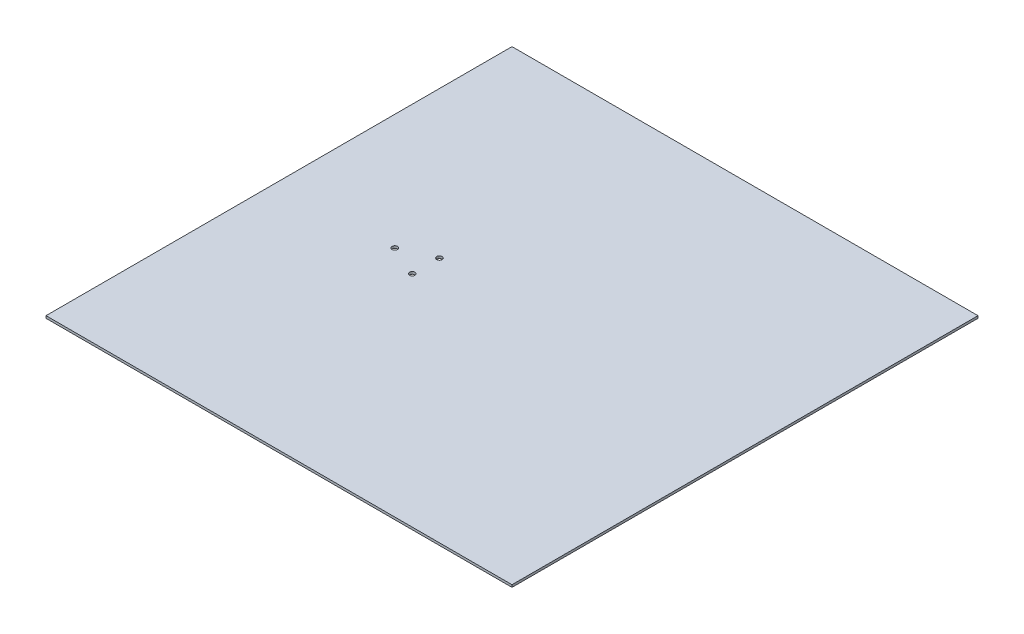
ISO-10303-21;
HEADER;
FILE_DESCRIPTION(('STEP AP214'),'2;1');
FILE_NAME('part.step','',(''),(''),'','','');
FILE_SCHEMA(('AUTOMOTIVE_DESIGN { 1 0 10303 214 1 1 1 1 }'));
ENDSEC;
DATA;
#1=APPLICATION_CONTEXT('core data for automotive mechanical design processes');
#2=APPLICATION_PROTOCOL_DEFINITION('international standard','automotive_design',2000,#1);
#3=PRODUCT_CONTEXT('',#1,'mechanical');
#4=PRODUCT('Part','Part','',(#3));
#5=PRODUCT_RELATED_PRODUCT_CATEGORY('part','',(#4));
#6=PRODUCT_DEFINITION_FORMATION('','',#4);
#7=PRODUCT_DEFINITION_CONTEXT('part definition',#1,'design');
#8=PRODUCT_DEFINITION('design','',#6,#7);
#9=PRODUCT_DEFINITION_SHAPE('','',#8);
#10=(LENGTH_UNIT() NAMED_UNIT(*) SI_UNIT(.MILLI.,.METRE.));
#11=(NAMED_UNIT(*) PLANE_ANGLE_UNIT() SI_UNIT($,.RADIAN.));
#12=(NAMED_UNIT(*) SI_UNIT($,.STERADIAN.) SOLID_ANGLE_UNIT());
#13=UNCERTAINTY_MEASURE_WITH_UNIT(LENGTH_MEASURE(1.E-05),#10,'distance_accuracy_value','');
#14=(GEOMETRIC_REPRESENTATION_CONTEXT(3) GLOBAL_UNCERTAINTY_ASSIGNED_CONTEXT((#13)) GLOBAL_UNIT_ASSIGNED_CONTEXT((#10,
#11,#12)) REPRESENTATION_CONTEXT('',''));
#15=CARTESIAN_POINT('',(0.,0.,0.));
#16=DIRECTION('',(0.,0.,1.));
#17=DIRECTION('',(1.,0.,0.));
#18=AXIS2_PLACEMENT_3D('',#15,#16,#17);
#19=CARTESIAN_POINT('',(300.,3.,-300.));
#20=DIRECTION('',(-1.,0.,0.));
#21=DIRECTION('',(0.,0.,1.));
#22=AXIS2_PLACEMENT_3D('',#19,#20,#21);
#23=PLANE('',#22);
#24=DIRECTION('',(0.,0.,-1.));
#25=VECTOR('',#24,1.);
#26=CARTESIAN_POINT('',(300.,0.,-300.));
#27=LINE('',#26,#25);
#28=CARTESIAN_POINT('',(300.,0.,300.));
#29=VERTEX_POINT('',#28);
#30=CARTESIAN_POINT('',(300.,0.,-300.));
#31=VERTEX_POINT('',#30);
#32=EDGE_CURVE('E99',#29,#31,#27,.T.);
#33=ORIENTED_EDGE('',*,*,#32,.T.);
#34=DIRECTION('',(0.,-1.,0.));
#35=VECTOR('',#34,1.);
#36=CARTESIAN_POINT('',(300.,3.,-300.));
#37=LINE('',#36,#35);
#38=CARTESIAN_POINT('',(300.,3.,-300.));
#39=VERTEX_POINT('',#38);
#40=EDGE_CURVE('E11',#39,#31,#37,.T.);
#41=ORIENTED_EDGE('',*,*,#40,.F.);
#42=DIRECTION('',(0.,0.,-1.));
#43=VECTOR('',#42,1.);
#44=CARTESIAN_POINT('',(300.,3.,-300.));
#45=LINE('',#44,#43);
#46=CARTESIAN_POINT('',(300.,3.,300.));
#47=VERTEX_POINT('',#46);
#48=EDGE_CURVE('E87',#47,#39,#45,.T.);
#49=ORIENTED_EDGE('',*,*,#48,.F.);
#50=DIRECTION('',(0.,-1.,0.));
#51=VECTOR('',#50,1.);
#52=CARTESIAN_POINT('',(300.,3.,300.));
#53=LINE('',#52,#51);
#54=EDGE_CURVE('E95',#47,#29,#53,.T.);
#55=ORIENTED_EDGE('',*,*,#54,.T.);
#56=EDGE_LOOP('',(#33,#41,#49,#55));
#57=FACE_BOUND('',#56,.T.);
#58=ADVANCED_FACE('F36',(#57),#23,.F.);
#59=CARTESIAN_POINT('',(-300.,3.,-300.));
#60=DIRECTION('',(0.,0.,1.));
#61=DIRECTION('',(1.,0.,0.));
#62=AXIS2_PLACEMENT_3D('',#59,#60,#61);
#63=PLANE('',#62);
#64=DIRECTION('',(-1.,0.,0.));
#65=VECTOR('',#64,1.);
#66=CARTESIAN_POINT('',(-300.,0.,-300.));
#67=LINE('',#66,#65);
#68=CARTESIAN_POINT('',(-300.,0.,-300.));
#69=VERTEX_POINT('',#68);
#70=EDGE_CURVE('E91',#31,#69,#67,.T.);
#71=ORIENTED_EDGE('',*,*,#70,.T.);
#72=DIRECTION('',(0.,-1.,0.));
#73=VECTOR('',#72,1.);
#74=CARTESIAN_POINT('',(-300.,3.,-300.));
#75=LINE('',#74,#73);
#76=CARTESIAN_POINT('',(-300.,3.,-300.));
#77=VERTEX_POINT('',#76);
#78=EDGE_CURVE('E44',#77,#69,#75,.T.);
#79=ORIENTED_EDGE('',*,*,#78,.F.);
#80=DIRECTION('',(-1.,0.,0.));
#81=VECTOR('',#80,1.);
#82=CARTESIAN_POINT('',(-300.,3.,-300.));
#83=LINE('',#82,#81);
#84=EDGE_CURVE('E82',#39,#77,#83,.T.);
#85=ORIENTED_EDGE('',*,*,#84,.F.);
#86=ORIENTED_EDGE('',*,*,#40,.T.);
#87=EDGE_LOOP('',(#71,#79,#85,#86));
#88=FACE_BOUND('',#87,.T.);
#89=ADVANCED_FACE('F90',(#88),#63,.F.);
#90=CARTESIAN_POINT('',(-300.,3.,-300.));
#91=DIRECTION('',(1.,0.,0.));
#92=DIRECTION('',(0.,0.,-1.));
#93=AXIS2_PLACEMENT_3D('',#90,#91,#92);
#94=PLANE('',#93);
#95=DIRECTION('',(0.,0.,1.));
#96=VECTOR('',#95,1.);
#97=CARTESIAN_POINT('',(-300.,0.,-300.));
#98=LINE('',#97,#96);
#99=CARTESIAN_POINT('',(-300.,0.,300.));
#100=VERTEX_POINT('',#99);
#101=EDGE_CURVE('E69',#69,#100,#98,.T.);
#102=ORIENTED_EDGE('',*,*,#101,.T.);
#103=DIRECTION('',(0.,-1.,0.));
#104=VECTOR('',#103,1.);
#105=CARTESIAN_POINT('',(-300.,3.,300.));
#106=LINE('',#105,#104);
#107=CARTESIAN_POINT('',(-300.,3.,300.));
#108=VERTEX_POINT('',#107);
#109=EDGE_CURVE('E92',#108,#100,#106,.T.);
#110=ORIENTED_EDGE('',*,*,#109,.F.);
#111=DIRECTION('',(0.,0.,1.));
#112=VECTOR('',#111,1.);
#113=CARTESIAN_POINT('',(-300.,3.,-300.));
#114=LINE('',#113,#112);
#115=EDGE_CURVE('E85',#77,#108,#114,.T.);
#116=ORIENTED_EDGE('',*,*,#115,.F.);
#117=ORIENTED_EDGE('',*,*,#78,.T.);
#118=EDGE_LOOP('',(#102,#110,#116,#117));
#119=FACE_BOUND('',#118,.T.);
#120=ADVANCED_FACE('F93',(#119),#94,.F.);
#121=CARTESIAN_POINT('',(-300.,3.,300.));
#122=DIRECTION('',(0.,0.,-1.));
#123=DIRECTION('',(-1.,0.,0.));
#124=AXIS2_PLACEMENT_3D('',#121,#122,#123);
#125=PLANE('',#124);
#126=DIRECTION('',(1.,0.,0.));
#127=VECTOR('',#126,1.);
#128=CARTESIAN_POINT('',(-300.,0.,300.));
#129=LINE('',#128,#127);
#130=EDGE_CURVE('E75',#100,#29,#129,.T.);
#131=ORIENTED_EDGE('',*,*,#130,.T.);
#132=ORIENTED_EDGE('',*,*,#54,.F.);
#133=DIRECTION('',(1.,0.,0.));
#134=VECTOR('',#133,1.);
#135=CARTESIAN_POINT('',(-300.,3.,300.));
#136=LINE('',#135,#134);
#137=EDGE_CURVE('E52',#108,#47,#136,.T.);
#138=ORIENTED_EDGE('',*,*,#137,.F.);
#139=ORIENTED_EDGE('',*,*,#109,.T.);
#140=EDGE_LOOP('',(#131,#132,#138,#139));
#141=FACE_BOUND('',#140,.T.);
#142=ADVANCED_FACE('F107',(#141),#125,.F.);
#143=CARTESIAN_POINT('',(0.,3.,0.));
#144=DIRECTION('',(0.,1.,0.));
#145=DIRECTION('',(0.,0.,1.));
#146=AXIS2_PLACEMENT_3D('',#143,#144,#145);
#147=PLANE('',#146);
#148=CARTESIAN_POINT('',(-150.928868976453,3.,-1.2490009027033E-13));
#149=DIRECTION('',(0.,1.,0.));
#150=DIRECTION('',(0.,0.,1.));
#151=AXIS2_PLACEMENT_3D('',#148,#149,#150);
#152=CIRCLE('',#151,3.54999999999999);
#153=CARTESIAN_POINT('',(-150.928868976453,3.,3.54999999999987));
#154=VERTEX_POINT('',#153);
#155=EDGE_CURVE('E122',#154,#154,#152,.T.);
#156=ORIENTED_EDGE('',*,*,#155,.F.);
#157=EDGE_LOOP('',(#156));
#158=FACE_BOUND('',#157,.T.);
#159=CARTESIAN_POINT('',(-110.928868976453,3.,17.4999999999997));
#160=DIRECTION('',(0.,1.,0.));
#161=DIRECTION('',(0.,0.,1.));
#162=AXIS2_PLACEMENT_3D('',#159,#160,#161);
#163=CIRCLE('',#162,3.50000000000001);
#164=CARTESIAN_POINT('',(-110.928868976453,3.,20.9999999999997));
#165=VERTEX_POINT('',#164);
#166=EDGE_CURVE('E102',#165,#165,#163,.T.);
#167=ORIENTED_EDGE('',*,*,#166,.F.);
#168=EDGE_LOOP('',(#167));
#169=FACE_BOUND('',#168,.T.);
#170=CARTESIAN_POINT('',(-110.928868976453,3.,-17.5000000000003));
#171=DIRECTION('',(0.,1.,0.));
#172=DIRECTION('',(0.,0.,1.));
#173=AXIS2_PLACEMENT_3D('',#170,#171,#172);
#174=CIRCLE('',#173,3.50000000000001);
#175=CARTESIAN_POINT('',(-110.928868976453,3.,-14.0000000000003));
#176=VERTEX_POINT('',#175);
#177=EDGE_CURVE('E115',#176,#176,#174,.T.);
#178=ORIENTED_EDGE('',*,*,#177,.F.);
#179=EDGE_LOOP('',(#178));
#180=FACE_BOUND('',#179,.T.);
#181=ORIENTED_EDGE('',*,*,#48,.T.);
#182=ORIENTED_EDGE('',*,*,#84,.T.);
#183=ORIENTED_EDGE('',*,*,#115,.T.);
#184=ORIENTED_EDGE('',*,*,#137,.T.);
#185=EDGE_LOOP('',(#181,#182,#183,#184));
#186=FACE_BOUND('',#185,.T.);
#187=ADVANCED_FACE('F83',(#158,#169,#180,#186),#147,.T.);
#188=CARTESIAN_POINT('',(0.,0.,0.));
#189=DIRECTION('',(0.,1.,0.));
#190=DIRECTION('',(0.,0.,1.));
#191=AXIS2_PLACEMENT_3D('',#188,#189,#190);
#192=PLANE('',#191);
#193=CARTESIAN_POINT('',(-150.928868976453,0.,-1.2490009027033E-13));
#194=DIRECTION('',(0.,1.,0.));
#195=DIRECTION('',(0.,0.,1.));
#196=AXIS2_PLACEMENT_3D('',#193,#194,#195);
#197=CIRCLE('',#196,3.54999999999999);
#198=CARTESIAN_POINT('',(-150.928868976453,0.,3.54999999999987));
#199=VERTEX_POINT('',#198);
#200=EDGE_CURVE('E127',#199,#199,#197,.T.);
#201=ORIENTED_EDGE('',*,*,#200,.T.);
#202=EDGE_LOOP('',(#201));
#203=FACE_BOUND('',#202,.T.);
#204=CARTESIAN_POINT('',(-110.928868976453,0.,17.4999999999997));
#205=DIRECTION('',(0.,1.,0.));
#206=DIRECTION('',(0.,0.,1.));
#207=AXIS2_PLACEMENT_3D('',#204,#205,#206);
#208=CIRCLE('',#207,3.50000000000001);
#209=CARTESIAN_POINT('',(-110.928868976453,0.,20.9999999999997));
#210=VERTEX_POINT('',#209);
#211=EDGE_CURVE('E118',#210,#210,#208,.T.);
#212=ORIENTED_EDGE('',*,*,#211,.T.);
#213=EDGE_LOOP('',(#212));
#214=FACE_BOUND('',#213,.T.);
#215=CARTESIAN_POINT('',(-110.928868976453,0.,-17.5000000000003));
#216=DIRECTION('',(0.,1.,0.));
#217=DIRECTION('',(0.,0.,1.));
#218=AXIS2_PLACEMENT_3D('',#215,#216,#217);
#219=CIRCLE('',#218,3.50000000000001);
#220=CARTESIAN_POINT('',(-110.928868976453,0.,-14.0000000000003));
#221=VERTEX_POINT('',#220);
#222=EDGE_CURVE('E119',#221,#221,#219,.T.);
#223=ORIENTED_EDGE('',*,*,#222,.T.);
#224=EDGE_LOOP('',(#223));
#225=FACE_BOUND('',#224,.T.);
#226=ORIENTED_EDGE('',*,*,#32,.F.);
#227=ORIENTED_EDGE('',*,*,#130,.F.);
#228=ORIENTED_EDGE('',*,*,#101,.F.);
#229=ORIENTED_EDGE('',*,*,#70,.F.);
#230=EDGE_LOOP('',(#226,#227,#228,#229));
#231=FACE_BOUND('',#230,.T.);
#232=ADVANCED_FACE('F110',(#203,#214,#225,#231),#192,.F.);
#233=CARTESIAN_POINT('',(-110.928868976453,0.,-17.5000000000003));
#234=DIRECTION('',(0.,1.,0.));
#235=DIRECTION('',(0.,0.,1.));
#236=AXIS2_PLACEMENT_3D('',#233,#234,#235);
#237=CYLINDRICAL_SURFACE('',#236,3.50000000000001);
#238=ORIENTED_EDGE('',*,*,#177,.T.);
#239=EDGE_LOOP('',(#238));
#240=FACE_BOUND('',#239,.T.);
#241=ORIENTED_EDGE('',*,*,#222,.F.);
#242=EDGE_LOOP('',(#241));
#243=FACE_BOUND('',#242,.T.);
#244=ADVANCED_FACE('F141',(#240,#243),#237,.F.);
#245=CARTESIAN_POINT('',(-110.928868976453,0.,17.4999999999997));
#246=DIRECTION('',(0.,1.,0.));
#247=DIRECTION('',(0.,0.,1.));
#248=AXIS2_PLACEMENT_3D('',#245,#246,#247);
#249=CYLINDRICAL_SURFACE('',#248,3.50000000000001);
#250=ORIENTED_EDGE('',*,*,#166,.T.);
#251=EDGE_LOOP('',(#250));
#252=FACE_BOUND('',#251,.T.);
#253=ORIENTED_EDGE('',*,*,#211,.F.);
#254=EDGE_LOOP('',(#253));
#255=FACE_BOUND('',#254,.T.);
#256=ADVANCED_FACE('F135',(#252,#255),#249,.F.);
#257=CARTESIAN_POINT('',(-150.928868976453,0.,-1.2490009027033E-13));
#258=DIRECTION('',(0.,1.,0.));
#259=DIRECTION('',(0.,0.,1.));
#260=AXIS2_PLACEMENT_3D('',#257,#258,#259);
#261=CYLINDRICAL_SURFACE('',#260,3.54999999999999);
#262=ORIENTED_EDGE('',*,*,#155,.T.);
#263=EDGE_LOOP('',(#262));
#264=FACE_BOUND('',#263,.T.);
#265=ORIENTED_EDGE('',*,*,#200,.F.);
#266=EDGE_LOOP('',(#265));
#267=FACE_BOUND('',#266,.T.);
#268=ADVANCED_FACE('F133',(#264,#267),#261,.F.);
#269=CLOSED_SHELL('',(#58,#89,#120,#142,#187,#232,#244,#256,#268));
#270=MANIFOLD_SOLID_BREP('B2',#269);
#271=ADVANCED_BREP_SHAPE_REPRESENTATION('',(#18,#270),#14);
#272=SHAPE_DEFINITION_REPRESENTATION(#9,#271);
ENDSEC;
END-ISO-10303-21;
